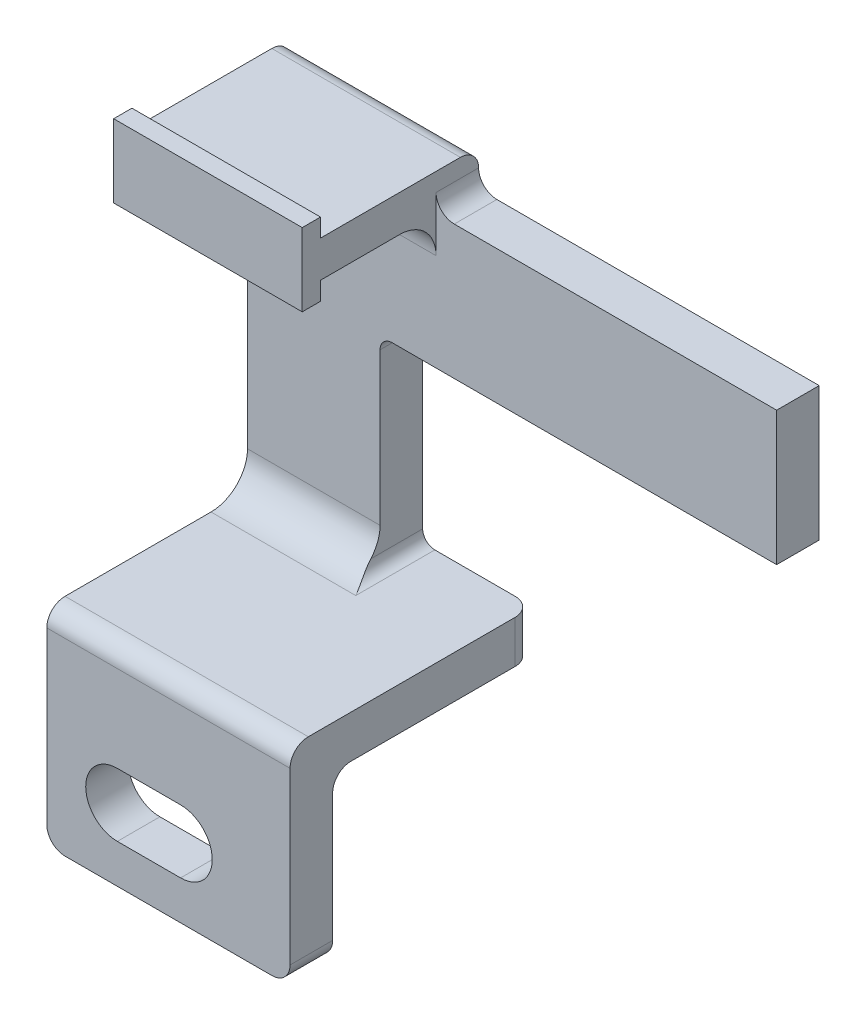
ISO-10303-21;
HEADER;
FILE_DESCRIPTION(('STEP AP214'),'2;1');
FILE_NAME('part.step','',(''),(''),'','','');
FILE_SCHEMA(('AUTOMOTIVE_DESIGN { 1 0 10303 214 1 1 1 1 }'));
ENDSEC;
DATA;
#1=APPLICATION_CONTEXT('core data for automotive mechanical design processes');
#2=APPLICATION_PROTOCOL_DEFINITION('international standard','automotive_design',2000,#1);
#3=PRODUCT_CONTEXT('',#1,'mechanical');
#4=PRODUCT('Part','Part','',(#3));
#5=PRODUCT_RELATED_PRODUCT_CATEGORY('part','',(#4));
#6=PRODUCT_DEFINITION_FORMATION('','',#4);
#7=PRODUCT_DEFINITION_CONTEXT('part definition',#1,'design');
#8=PRODUCT_DEFINITION('design','',#6,#7);
#9=PRODUCT_DEFINITION_SHAPE('','',#8);
#10=(LENGTH_UNIT() NAMED_UNIT(*) SI_UNIT(.MILLI.,.METRE.));
#11=(NAMED_UNIT(*) PLANE_ANGLE_UNIT() SI_UNIT($,.RADIAN.));
#12=(NAMED_UNIT(*) SI_UNIT($,.STERADIAN.) SOLID_ANGLE_UNIT());
#13=UNCERTAINTY_MEASURE_WITH_UNIT(LENGTH_MEASURE(1.E-05),#10,'distance_accuracy_value','');
#14=(GEOMETRIC_REPRESENTATION_CONTEXT(3) GLOBAL_UNCERTAINTY_ASSIGNED_CONTEXT((#13)) GLOBAL_UNIT_ASSIGNED_CONTEXT((#10,
#11,#12)) REPRESENTATION_CONTEXT('',''));
#15=CARTESIAN_POINT('',(0.,0.,0.));
#16=DIRECTION('',(0.,0.,1.));
#17=DIRECTION('',(1.,0.,0.));
#18=AXIS2_PLACEMENT_3D('',#15,#16,#17);
#19=CARTESIAN_POINT('',(9.1,-3.5,20.));
#20=DIRECTION('',(0.,0.,-1.));
#21=DIRECTION('',(-1.,0.,0.));
#22=AXIS2_PLACEMENT_3D('',#19,#20,#21);
#23=PLANE('',#22);
#24=DIRECTION('',(0.,1.,0.));
#25=VECTOR('',#24,1.);
#26=CARTESIAN_POINT('',(9.1,-3.5,20.));
#27=LINE('',#26,#25);
#28=CARTESIAN_POINT('',(9.1,-15.5,20.));
#29=VERTEX_POINT('',#28);
#30=CARTESIAN_POINT('',(9.1,-1.5,20.));
#31=VERTEX_POINT('',#30);
#32=EDGE_CURVE('E369',#29,#31,#27,.T.);
#33=ORIENTED_EDGE('',*,*,#32,.T.);
#34=DIRECTION('',(-1.,0.,0.));
#35=VECTOR('',#34,1.);
#36=CARTESIAN_POINT('',(9.1,-1.5,20.));
#37=LINE('',#36,#35);
#38=CARTESIAN_POINT('',(-10.9,-1.5,20.));
#39=VERTEX_POINT('',#38);
#40=EDGE_CURVE('E617',#31,#39,#37,.T.);
#41=ORIENTED_EDGE('',*,*,#40,.T.);
#42=DIRECTION('',(0.,1.,0.));
#43=VECTOR('',#42,1.);
#44=CARTESIAN_POINT('',(-10.9,-3.5,20.));
#45=LINE('',#44,#43);
#46=CARTESIAN_POINT('',(-10.9,-15.5,20.));
#47=VERTEX_POINT('',#46);
#48=EDGE_CURVE('E360',#47,#39,#45,.T.);
#49=ORIENTED_EDGE('',*,*,#48,.F.);
#50=CARTESIAN_POINT('',(-9.4,-15.5,20.));
#51=DIRECTION('',(0.,0.,-1.));
#52=DIRECTION('',(-1.,0.,0.));
#53=AXIS2_PLACEMENT_3D('',#50,#51,#52);
#54=CIRCLE('',#53,1.5);
#55=CARTESIAN_POINT('',(-9.39999999999999,-17.,20.));
#56=VERTEX_POINT('',#55);
#57=EDGE_CURVE('E615',#47,#56,#54,.F.);
#58=ORIENTED_EDGE('',*,*,#57,.T.);
#59=DIRECTION('',(-1.,0.,0.));
#60=VECTOR('',#59,1.);
#61=CARTESIAN_POINT('',(9.1,-17.,20.));
#62=LINE('',#61,#60);
#63=CARTESIAN_POINT('',(7.6,-17.,20.));
#64=VERTEX_POINT('',#63);
#65=EDGE_CURVE('E332',#64,#56,#62,.T.);
#66=ORIENTED_EDGE('',*,*,#65,.F.);
#67=CARTESIAN_POINT('',(7.6,-15.5,20.));
#68=DIRECTION('',(0.,0.,-1.));
#69=DIRECTION('',(-1.,0.,0.));
#70=AXIS2_PLACEMENT_3D('',#67,#68,#69);
#71=CIRCLE('',#70,1.5);
#72=EDGE_CURVE('E612',#64,#29,#71,.F.);
#73=ORIENTED_EDGE('',*,*,#72,.T.);
#74=EDGE_LOOP('',(#33,#41,#49,#58,#66,#73));
#75=FACE_BOUND('',#74,.T.);
#76=DIRECTION('',(1.,0.,0.));
#77=VECTOR('',#76,1.);
#78=CARTESIAN_POINT('',(0.,-8.6,20.));
#79=LINE('',#78,#77);
#80=CARTESIAN_POINT('',(-5.1,-8.6,20.));
#81=VERTEX_POINT('',#80);
#82=CARTESIAN_POINT('',(0.100000000000003,-8.6,20.));
#83=VERTEX_POINT('',#82);
#84=EDGE_CURVE('E266',#81,#83,#79,.T.);
#85=ORIENTED_EDGE('',*,*,#84,.T.);
#86=CARTESIAN_POINT('',(0.100000000000003,-11.2,20.));
#87=DIRECTION('',(0.,0.,-1.));
#88=DIRECTION('',(-1.,0.,0.));
#89=AXIS2_PLACEMENT_3D('',#86,#87,#88);
#90=CIRCLE('',#89,2.6);
#91=CARTESIAN_POINT('',(0.100000000000003,-13.8,20.));
#92=VERTEX_POINT('',#91);
#93=EDGE_CURVE('E289',#92,#83,#90,.F.);
#94=ORIENTED_EDGE('',*,*,#93,.F.);
#95=DIRECTION('',(1.,0.,0.));
#96=VECTOR('',#95,1.);
#97=CARTESIAN_POINT('',(0.,-13.8,20.));
#98=LINE('',#97,#96);
#99=CARTESIAN_POINT('',(-5.1,-13.8,20.));
#100=VERTEX_POINT('',#99);
#101=EDGE_CURVE('E730',#100,#92,#98,.T.);
#102=ORIENTED_EDGE('',*,*,#101,.F.);
#103=CARTESIAN_POINT('',(-5.1,-11.2,20.));
#104=DIRECTION('',(0.,0.,-1.));
#105=DIRECTION('',(-1.,0.,0.));
#106=AXIS2_PLACEMENT_3D('',#103,#104,#105);
#107=CIRCLE('',#106,2.6);
#108=EDGE_CURVE('E733',#81,#100,#107,.F.);
#109=ORIENTED_EDGE('',*,*,#108,.F.);
#110=EDGE_LOOP('',(#85,#94,#102,#109));
#111=FACE_BOUND('',#110,.T.);
#112=ADVANCED_FACE('F43',(#75,#111),#23,.F.);
#113=CARTESIAN_POINT('',(-10.9,-17.,16.5));
#114=DIRECTION('',(0.,0.,1.));
#115=DIRECTION('',(1.,0.,0.));
#116=AXIS2_PLACEMENT_3D('',#113,#114,#115);
#117=PLANE('',#116);
#118=DIRECTION('',(0.,1.,0.));
#119=VECTOR('',#118,1.);
#120=CARTESIAN_POINT('',(9.10000000000001,-17.,16.5));
#121=LINE('',#120,#119);
#122=CARTESIAN_POINT('',(9.10000000000001,-15.5,16.5));
#123=VERTEX_POINT('',#122);
#124=CARTESIAN_POINT('',(9.10000000000001,-5.,16.5));
#125=VERTEX_POINT('',#124);
#126=EDGE_CURVE('E344',#123,#125,#121,.T.);
#127=ORIENTED_EDGE('',*,*,#126,.F.);
#128=CARTESIAN_POINT('',(7.6,-15.5,16.5));
#129=DIRECTION('',(0.,0.,1.));
#130=DIRECTION('',(1.,0.,0.));
#131=AXIS2_PLACEMENT_3D('',#128,#129,#130);
#132=CIRCLE('',#131,1.5);
#133=CARTESIAN_POINT('',(7.6,-17.,16.5));
#134=VERTEX_POINT('',#133);
#135=EDGE_CURVE('E584',#123,#134,#132,.F.);
#136=ORIENTED_EDGE('',*,*,#135,.T.);
#137=DIRECTION('',(1.,0.,0.));
#138=VECTOR('',#137,1.);
#139=CARTESIAN_POINT('',(-10.9,-17.,16.5));
#140=LINE('',#139,#138);
#141=CARTESIAN_POINT('',(-9.4,-17.,16.5));
#142=VERTEX_POINT('',#141);
#143=EDGE_CURVE('E341',#142,#134,#140,.T.);
#144=ORIENTED_EDGE('',*,*,#143,.F.);
#145=CARTESIAN_POINT('',(-9.4,-15.5,16.5));
#146=DIRECTION('',(0.,0.,1.));
#147=DIRECTION('',(1.,0.,0.));
#148=AXIS2_PLACEMENT_3D('',#145,#146,#147);
#149=CIRCLE('',#148,1.5);
#150=CARTESIAN_POINT('',(-10.9,-15.5,16.5));
#151=VERTEX_POINT('',#150);
#152=EDGE_CURVE('E582',#142,#151,#149,.F.);
#153=ORIENTED_EDGE('',*,*,#152,.T.);
#154=DIRECTION('',(0.,1.,0.));
#155=VECTOR('',#154,1.);
#156=CARTESIAN_POINT('',(-10.9,-17.,16.5));
#157=LINE('',#156,#155);
#158=CARTESIAN_POINT('',(-10.9,-5.,16.5));
#159=VERTEX_POINT('',#158);
#160=EDGE_CURVE('E347',#151,#159,#157,.T.);
#161=ORIENTED_EDGE('',*,*,#160,.T.);
#162=DIRECTION('',(1.,0.,0.));
#163=VECTOR('',#162,1.);
#164=CARTESIAN_POINT('',(-10.9,-5.,16.5));
#165=LINE('',#164,#163);
#166=EDGE_CURVE('E579',#159,#125,#165,.T.);
#167=ORIENTED_EDGE('',*,*,#166,.T.);
#168=EDGE_LOOP('',(#127,#136,#144,#153,#161,#167));
#169=FACE_BOUND('',#168,.T.);
#170=DIRECTION('',(-1.,0.,0.));
#171=VECTOR('',#170,1.);
#172=CARTESIAN_POINT('',(0.,-8.6,16.5));
#173=LINE('',#172,#171);
#174=CARTESIAN_POINT('',(0.100000000000003,-8.6,16.5));
#175=VERTEX_POINT('',#174);
#176=CARTESIAN_POINT('',(-5.1,-8.6,16.5));
#177=VERTEX_POINT('',#176);
#178=EDGE_CURVE('E263',#175,#177,#173,.T.);
#179=ORIENTED_EDGE('',*,*,#178,.T.);
#180=CARTESIAN_POINT('',(-5.1,-11.2,16.5));
#181=DIRECTION('',(0.,0.,-1.));
#182=DIRECTION('',(-1.,0.,0.));
#183=AXIS2_PLACEMENT_3D('',#180,#181,#182);
#184=CIRCLE('',#183,2.6);
#185=CARTESIAN_POINT('',(-5.1,-13.8,16.5));
#186=VERTEX_POINT('',#185);
#187=EDGE_CURVE('E271',#186,#177,#184,.T.);
#188=ORIENTED_EDGE('',*,*,#187,.F.);
#189=DIRECTION('',(-1.,0.,0.));
#190=VECTOR('',#189,1.);
#191=CARTESIAN_POINT('',(0.,-13.8,16.5));
#192=LINE('',#191,#190);
#193=CARTESIAN_POINT('',(0.100000000000003,-13.8,16.5));
#194=VERTEX_POINT('',#193);
#195=EDGE_CURVE('E66',#194,#186,#192,.T.);
#196=ORIENTED_EDGE('',*,*,#195,.F.);
#197=CARTESIAN_POINT('',(0.100000000000003,-11.2,16.5));
#198=DIRECTION('',(0.,0.,-1.));
#199=DIRECTION('',(-1.,0.,0.));
#200=AXIS2_PLACEMENT_3D('',#197,#198,#199);
#201=CIRCLE('',#200,2.6);
#202=EDGE_CURVE('E278',#175,#194,#201,.T.);
#203=ORIENTED_EDGE('',*,*,#202,.F.);
#204=EDGE_LOOP('',(#179,#188,#196,#203));
#205=FACE_BOUND('',#204,.T.);
#206=ADVANCED_FACE('F276',(#169,#205),#117,.F.);
#207=CARTESIAN_POINT('',(32.6,27.5,3.5));
#208=DIRECTION('',(0.,-1.,0.));
#209=DIRECTION('',(1.,0.,0.));
#210=AXIS2_PLACEMENT_3D('',#207,#208,#209);
#211=PLANE('',#210);
#212=DIRECTION('',(-1.,0.,0.));
#213=VECTOR('',#212,1.);
#214=CARTESIAN_POINT('',(32.6,27.5,0.));
#215=LINE('',#214,#213);
#216=CARTESIAN_POINT('',(32.6,27.5,0.));
#217=VERTEX_POINT('',#216);
#218=CARTESIAN_POINT('',(6.1,27.5,0.));
#219=VERTEX_POINT('',#218);
#220=EDGE_CURVE('E396',#217,#219,#215,.T.);
#221=ORIENTED_EDGE('',*,*,#220,.T.);
#222=DIRECTION('',(0.,0.,-1.));
#223=VECTOR('',#222,1.);
#224=CARTESIAN_POINT('',(6.1,27.5,3.5));
#225=LINE('',#224,#223);
#226=CARTESIAN_POINT('',(6.1,27.5,3.5));
#227=VERTEX_POINT('',#226);
#228=EDGE_CURVE('E566',#219,#227,#225,.F.);
#229=ORIENTED_EDGE('',*,*,#228,.T.);
#230=DIRECTION('',(-1.,0.,0.));
#231=VECTOR('',#230,1.);
#232=CARTESIAN_POINT('',(32.6,27.5,3.5));
#233=LINE('',#232,#231);
#234=CARTESIAN_POINT('',(32.6,27.5,3.5));
#235=VERTEX_POINT('',#234);
#236=EDGE_CURVE('E382',#235,#227,#233,.T.);
#237=ORIENTED_EDGE('',*,*,#236,.F.);
#238=DIRECTION('',(0.,0.,-1.));
#239=VECTOR('',#238,1.);
#240=CARTESIAN_POINT('',(32.6,27.5,3.5));
#241=LINE('',#240,#239);
#242=EDGE_CURVE('E388',#235,#217,#241,.T.);
#243=ORIENTED_EDGE('',*,*,#242,.T.);
#244=EDGE_LOOP('',(#221,#229,#237,#243));
#245=FACE_BOUND('',#244,.T.);
#246=ADVANCED_FACE('F494',(#245),#211,.F.);
#247=CARTESIAN_POINT('',(0.,0.,3.5));
#248=DIRECTION('',(-1.,0.,0.));
#249=DIRECTION('',(0.,0.,1.));
#250=AXIS2_PLACEMENT_3D('',#247,#248,#249);
#251=PLANE('',#250);
#252=DIRECTION('',(0.,1.,0.));
#253=VECTOR('',#252,1.);
#254=CARTESIAN_POINT('',(0.,0.,3.5));
#255=LINE('',#254,#253);
#256=CARTESIAN_POINT('',(0.,3.,3.5));
#257=VERTEX_POINT('',#256);
#258=CARTESIAN_POINT('',(0.,15.5,3.5));
#259=VERTEX_POINT('',#258);
#260=EDGE_CURVE('E373',#257,#259,#255,.T.);
#261=ORIENTED_EDGE('',*,*,#260,.F.);
#262=CARTESIAN_POINT('',(0.,3.,6.5));
#263=DIRECTION('',(-1.,0.,0.));
#264=DIRECTION('',(0.,0.,1.));
#265=AXIS2_PLACEMENT_3D('',#262,#263,#264);
#266=CIRCLE('',#265,3.);
#267=CARTESIAN_POINT('',(0.,1.,4.26393202250021));
#268=VERTEX_POINT('',#267);
#269=EDGE_CURVE('E437',#257,#268,#266,.T.);
#270=ORIENTED_EDGE('',*,*,#269,.T.);
#271=DIRECTION('',(0.,0.,-1.));
#272=VECTOR('',#271,1.);
#273=CARTESIAN_POINT('',(0.,1.,0.));
#274=LINE('',#273,#272);
#275=CARTESIAN_POINT('',(0.,1.,0.));
#276=VERTEX_POINT('',#275);
#277=EDGE_CURVE('E412',#268,#276,#274,.T.);
#278=ORIENTED_EDGE('',*,*,#277,.T.);
#279=DIRECTION('',(0.,1.,0.));
#280=VECTOR('',#279,1.);
#281=CARTESIAN_POINT('',(0.,0.,0.));
#282=LINE('',#281,#280);
#283=CARTESIAN_POINT('',(0.,15.5,0.));
#284=VERTEX_POINT('',#283);
#285=EDGE_CURVE('E372',#276,#284,#282,.T.);
#286=ORIENTED_EDGE('',*,*,#285,.T.);
#287=DIRECTION('',(0.,0.,-1.));
#288=VECTOR('',#287,1.);
#289=CARTESIAN_POINT('',(0.,15.5,3.5));
#290=LINE('',#289,#288);
#291=EDGE_CURVE('E409',#259,#284,#290,.T.);
#292=ORIENTED_EDGE('',*,*,#291,.F.);
#293=EDGE_LOOP('',(#261,#270,#278,#286,#292));
#294=FACE_BOUND('',#293,.T.);
#295=ADVANCED_FACE('F522',(#294),#251,.F.);
#296=CARTESIAN_POINT('',(1.,15.5,3.5));
#297=DIRECTION('',(0.,0.,-1.));
#298=DIRECTION('',(-1.,0.,0.));
#299=AXIS2_PLACEMENT_3D('',#296,#297,#298);
#300=CYLINDRICAL_SURFACE('',#299,1.);
#301=CARTESIAN_POINT('',(1.,15.5,0.));
#302=DIRECTION('',(0.,0.,-1.));
#303=DIRECTION('',(-1.,0.,0.));
#304=AXIS2_PLACEMENT_3D('',#301,#302,#303);
#305=CIRCLE('',#304,1.);
#306=CARTESIAN_POINT('',(1.00000000000001,16.5,0.));
#307=VERTEX_POINT('',#306);
#308=EDGE_CURVE('E390',#284,#307,#305,.T.);
#309=ORIENTED_EDGE('',*,*,#308,.T.);
#310=DIRECTION('',(0.,0.,-1.));
#311=VECTOR('',#310,1.);
#312=CARTESIAN_POINT('',(1.00000000000001,16.5,3.5));
#313=LINE('',#312,#311);
#314=CARTESIAN_POINT('',(1.00000000000001,16.5,3.5));
#315=VERTEX_POINT('',#314);
#316=EDGE_CURVE('E406',#315,#307,#313,.T.);
#317=ORIENTED_EDGE('',*,*,#316,.F.);
#318=CARTESIAN_POINT('',(1.,15.5,3.5));
#319=DIRECTION('',(0.,0.,-1.));
#320=DIRECTION('',(-1.,0.,0.));
#321=AXIS2_PLACEMENT_3D('',#318,#319,#320);
#322=CIRCLE('',#321,1.);
#323=EDGE_CURVE('E375',#259,#315,#322,.T.);
#324=ORIENTED_EDGE('',*,*,#323,.F.);
#325=ORIENTED_EDGE('',*,*,#291,.T.);
#326=EDGE_LOOP('',(#309,#317,#324,#325));
#327=FACE_BOUND('',#326,.T.);
#328=ADVANCED_FACE('F530',(#327),#300,.F.);
#329=CARTESIAN_POINT('',(1.00000000000001,16.5,3.5));
#330=DIRECTION('',(0.,1.,0.));
#331=DIRECTION('',(0.,0.,1.));
#332=AXIS2_PLACEMENT_3D('',#329,#330,#331);
#333=PLANE('',#332);
#334=DIRECTION('',(1.,0.,0.));
#335=VECTOR('',#334,1.);
#336=CARTESIAN_POINT('',(1.00000000000001,16.5,0.));
#337=LINE('',#336,#335);
#338=CARTESIAN_POINT('',(32.6,16.5,0.));
#339=VERTEX_POINT('',#338);
#340=EDGE_CURVE('E392',#307,#339,#337,.T.);
#341=ORIENTED_EDGE('',*,*,#340,.T.);
#342=DIRECTION('',(0.,0.,-1.));
#343=VECTOR('',#342,1.);
#344=CARTESIAN_POINT('',(32.6,16.5,3.5));
#345=LINE('',#344,#343);
#346=CARTESIAN_POINT('',(32.6,16.5,3.5));
#347=VERTEX_POINT('',#346);
#348=EDGE_CURVE('E403',#347,#339,#345,.T.);
#349=ORIENTED_EDGE('',*,*,#348,.F.);
#350=DIRECTION('',(1.,0.,0.));
#351=VECTOR('',#350,1.);
#352=CARTESIAN_POINT('',(1.00000000000001,16.5,3.5));
#353=LINE('',#352,#351);
#354=EDGE_CURVE('E378',#315,#347,#353,.T.);
#355=ORIENTED_EDGE('',*,*,#354,.F.);
#356=ORIENTED_EDGE('',*,*,#316,.T.);
#357=EDGE_LOOP('',(#341,#349,#355,#356));
#358=FACE_BOUND('',#357,.T.);
#359=ADVANCED_FACE('F526',(#358),#333,.F.);
#360=CARTESIAN_POINT('',(32.6,16.5,3.5));
#361=DIRECTION('',(-1.,0.,0.));
#362=DIRECTION('',(0.,-1.,0.));
#363=AXIS2_PLACEMENT_3D('',#360,#361,#362);
#364=PLANE('',#363);
#365=DIRECTION('',(0.,1.,0.));
#366=VECTOR('',#365,1.);
#367=CARTESIAN_POINT('',(32.6,16.5,0.));
#368=LINE('',#367,#366);
#369=EDGE_CURVE('E394',#339,#217,#368,.T.);
#370=ORIENTED_EDGE('',*,*,#369,.T.);
#371=ORIENTED_EDGE('',*,*,#242,.F.);
#372=DIRECTION('',(0.,1.,0.));
#373=VECTOR('',#372,1.);
#374=CARTESIAN_POINT('',(32.6,16.5,3.5));
#375=LINE('',#374,#373);
#376=EDGE_CURVE('E380',#347,#235,#375,.T.);
#377=ORIENTED_EDGE('',*,*,#376,.F.);
#378=ORIENTED_EDGE('',*,*,#348,.T.);
#379=EDGE_LOOP('',(#370,#371,#377,#378));
#380=FACE_BOUND('',#379,.T.);
#381=ADVANCED_FACE('F518',(#380),#364,.F.);
#382=CARTESIAN_POINT('',(-10.9,27.5,3.5));
#383=DIRECTION('',(1.,0.,0.));
#384=DIRECTION('',(0.,1.,0.));
#385=AXIS2_PLACEMENT_3D('',#382,#383,#384);
#386=PLANE('',#385);
#387=ORIENTED_EDGE('',*,*,#48,.T.);
#388=CARTESIAN_POINT('',(-10.9,-1.5,18.5));
#389=DIRECTION('',(1.,0.,0.));
#390=DIRECTION('',(0.,1.,0.));
#391=AXIS2_PLACEMENT_3D('',#388,#389,#390);
#392=CIRCLE('',#391,1.5);
#393=CARTESIAN_POINT('',(-10.9,0.,18.5));
#394=VERTEX_POINT('',#393);
#395=EDGE_CURVE('E624',#39,#394,#392,.F.);
#396=ORIENTED_EDGE('',*,*,#395,.T.);
#397=DIRECTION('',(0.,0.,-1.));
#398=VECTOR('',#397,1.);
#399=CARTESIAN_POINT('',(-10.9,0.,20.));
#400=LINE('',#399,#398);
#401=CARTESIAN_POINT('',(-10.9,0.,6.5));
#402=VERTEX_POINT('',#401);
#403=EDGE_CURVE('E350',#394,#402,#400,.T.);
#404=ORIENTED_EDGE('',*,*,#403,.T.);
#405=CARTESIAN_POINT('',(-10.9,3.,6.5));
#406=DIRECTION('',(1.,0.,0.));
#407=DIRECTION('',(0.,1.,0.));
#408=AXIS2_PLACEMENT_3D('',#405,#406,#407);
#409=CIRCLE('',#408,3.);
#410=CARTESIAN_POINT('',(-10.9,3.,3.5));
#411=VERTEX_POINT('',#410);
#412=EDGE_CURVE('E449',#402,#411,#409,.T.);
#413=ORIENTED_EDGE('',*,*,#412,.T.);
#414=DIRECTION('',(0.,-1.,0.));
#415=VECTOR('',#414,1.);
#416=CARTESIAN_POINT('',(-10.9,27.5,3.5));
#417=LINE('',#416,#415);
#418=CARTESIAN_POINT('',(-10.9,24.5,3.5));
#419=VERTEX_POINT('',#418);
#420=EDGE_CURVE('E385',#419,#411,#417,.T.);
#421=ORIENTED_EDGE('',*,*,#420,.F.);
#422=CARTESIAN_POINT('',(-10.9,24.5,6.5));
#423=DIRECTION('',(1.,0.,0.));
#424=DIRECTION('',(0.,1.,0.));
#425=AXIS2_PLACEMENT_3D('',#422,#423,#424);
#426=CIRCLE('',#425,3.);
#427=CARTESIAN_POINT('',(-10.9,27.5,6.5));
#428=VERTEX_POINT('',#427);
#429=EDGE_CURVE('E433',#419,#428,#426,.T.);
#430=ORIENTED_EDGE('',*,*,#429,.T.);
#431=DIRECTION('',(0.,0.,1.));
#432=VECTOR('',#431,1.);
#433=CARTESIAN_POINT('',(-10.9,27.5,13.));
#434=LINE('',#433,#432);
#435=CARTESIAN_POINT('',(-10.9,27.5,13.));
#436=VERTEX_POINT('',#435);
#437=EDGE_CURVE('E323',#428,#436,#434,.T.);
#438=ORIENTED_EDGE('',*,*,#437,.T.);
#439=DIRECTION('',(0.,-1.,0.));
#440=VECTOR('',#439,1.);
#441=CARTESIAN_POINT('',(-10.9,32.,13.));
#442=LINE('',#441,#440);
#443=CARTESIAN_POINT('',(-10.9,26.,13.));
#444=VERTEX_POINT('',#443);
#445=EDGE_CURVE('E305',#436,#444,#442,.T.);
#446=ORIENTED_EDGE('',*,*,#445,.T.);
#447=DIRECTION('',(0.,0.,-1.));
#448=VECTOR('',#447,1.);
#449=CARTESIAN_POINT('',(-10.9,26.,14.5));
#450=LINE('',#449,#448);
#451=CARTESIAN_POINT('',(-10.9,26.,14.5));
#452=VERTEX_POINT('',#451);
#453=EDGE_CURVE('E320',#452,#444,#450,.T.);
#454=ORIENTED_EDGE('',*,*,#453,.F.);
#455=DIRECTION('',(0.,-1.,0.));
#456=VECTOR('',#455,1.);
#457=CARTESIAN_POINT('',(-10.9,32.,14.5));
#458=LINE('',#457,#456);
#459=CARTESIAN_POINT('',(-10.9,32.,14.5));
#460=VERTEX_POINT('',#459);
#461=EDGE_CURVE('E290',#460,#452,#458,.T.);
#462=ORIENTED_EDGE('',*,*,#461,.F.);
#463=DIRECTION('',(0.,0.,-1.));
#464=VECTOR('',#463,1.);
#465=CARTESIAN_POINT('',(-10.9,32.,14.5));
#466=LINE('',#465,#464);
#467=CARTESIAN_POINT('',(-10.9,32.,13.));
#468=VERTEX_POINT('',#467);
#469=EDGE_CURVE('E300',#460,#468,#466,.T.);
#470=ORIENTED_EDGE('',*,*,#469,.T.);
#471=CARTESIAN_POINT('',(-10.9,30.5,13.));
#472=VERTEX_POINT('',#471);
#473=EDGE_CURVE('E301',#468,#472,#442,.T.);
#474=ORIENTED_EDGE('',*,*,#473,.T.);
#475=DIRECTION('',(0.,0.,1.));
#476=VECTOR('',#475,1.);
#477=CARTESIAN_POINT('',(-10.9,30.5,0.));
#478=LINE('',#477,#476);
#479=CARTESIAN_POINT('',(-10.9,30.5,1.5));
#480=VERTEX_POINT('',#479);
#481=EDGE_CURVE('E324',#480,#472,#478,.T.);
#482=ORIENTED_EDGE('',*,*,#481,.F.);
#483=CARTESIAN_POINT('',(-10.9,29.,1.5));
#484=DIRECTION('',(1.,0.,0.));
#485=DIRECTION('',(0.,1.,0.));
#486=AXIS2_PLACEMENT_3D('',#483,#484,#485);
#487=CIRCLE('',#486,1.5);
#488=CARTESIAN_POINT('',(-10.9,29.,0.));
#489=VERTEX_POINT('',#488);
#490=EDGE_CURVE('E622',#480,#489,#487,.F.);
#491=ORIENTED_EDGE('',*,*,#490,.T.);
#492=DIRECTION('',(0.,-1.,0.));
#493=VECTOR('',#492,1.);
#494=CARTESIAN_POINT('',(-10.9,27.5,0.));
#495=LINE('',#494,#493);
#496=CARTESIAN_POINT('',(-10.9,-3.5,0.));
#497=VERTEX_POINT('',#496);
#498=EDGE_CURVE('E376',#489,#497,#495,.T.);
#499=ORIENTED_EDGE('',*,*,#498,.T.);
#500=DIRECTION('',(0.,0.,-1.));
#501=VECTOR('',#500,1.);
#502=CARTESIAN_POINT('',(-10.9,-3.5,20.));
#503=LINE('',#502,#501);
#504=CARTESIAN_POINT('',(-10.9,-3.5,15.));
#505=VERTEX_POINT('',#504);
#506=EDGE_CURVE('E351',#505,#497,#503,.T.);
#507=ORIENTED_EDGE('',*,*,#506,.F.);
#508=CARTESIAN_POINT('',(-10.9,-5.,15.));
#509=DIRECTION('',(1.,0.,0.));
#510=DIRECTION('',(0.,1.,0.));
#511=AXIS2_PLACEMENT_3D('',#508,#509,#510);
#512=CIRCLE('',#511,1.5);
#513=EDGE_CURVE('E11',#505,#159,#512,.T.);
#514=ORIENTED_EDGE('',*,*,#513,.T.);
#515=ORIENTED_EDGE('',*,*,#160,.F.);
#516=DIRECTION('',(0.,0.,-1.));
#517=VECTOR('',#516,1.);
#518=CARTESIAN_POINT('',(-10.9,-15.5,20.));
#519=LINE('',#518,#517);
#520=EDGE_CURVE('E607',#151,#47,#519,.F.);
#521=ORIENTED_EDGE('',*,*,#520,.T.);
#522=EDGE_LOOP('',(#387,#396,#404,#413,#421,#430,#438,#446,#454,#462,#470,#474,#482,#491,#499,
#507,#514,#515,#521));
#523=FACE_BOUND('',#522,.T.);
#524=ADVANCED_FACE('F511',(#523),#386,.F.);
#525=CARTESIAN_POINT('',(1.,15.5,3.5));
#526=DIRECTION('',(0.,0.,-1.));
#527=DIRECTION('',(-1.,0.,0.));
#528=AXIS2_PLACEMENT_3D('',#525,#526,#527);
#529=PLANE('',#528);
#530=DIRECTION('',(0.,-1.,0.));
#531=VECTOR('',#530,1.);
#532=CARTESIAN_POINT('',(4.6,30.5,3.5));
#533=LINE('',#532,#531);
#534=CARTESIAN_POINT('',(4.6,29.,3.5));
#535=VERTEX_POINT('',#534);
#536=CARTESIAN_POINT('',(4.6,24.5,3.5));
#537=VERTEX_POINT('',#536);
#538=EDGE_CURVE('E422',#535,#537,#533,.T.);
#539=ORIENTED_EDGE('',*,*,#538,.T.);
#540=DIRECTION('',(-1.,0.,0.));
#541=VECTOR('',#540,1.);
#542=CARTESIAN_POINT('',(-10.9,24.5,3.5));
#543=LINE('',#542,#541);
#544=EDGE_CURVE('E425',#537,#419,#543,.T.);
#545=ORIENTED_EDGE('',*,*,#544,.T.);
#546=ORIENTED_EDGE('',*,*,#420,.T.);
#547=DIRECTION('',(1.,0.,0.));
#548=VECTOR('',#547,1.);
#549=CARTESIAN_POINT('',(1.,3.,3.5));
#550=LINE('',#549,#548);
#551=EDGE_CURVE('E419',#411,#257,#550,.T.);
#552=ORIENTED_EDGE('',*,*,#551,.T.);
#553=ORIENTED_EDGE('',*,*,#260,.T.);
#554=ORIENTED_EDGE('',*,*,#323,.T.);
#555=ORIENTED_EDGE('',*,*,#354,.T.);
#556=ORIENTED_EDGE('',*,*,#376,.T.);
#557=ORIENTED_EDGE('',*,*,#236,.T.);
#558=CARTESIAN_POINT('',(6.1,29.,3.5));
#559=DIRECTION('',(0.,0.,-1.));
#560=DIRECTION('',(-1.,0.,0.));
#561=AXIS2_PLACEMENT_3D('',#558,#559,#560);
#562=CIRCLE('',#561,1.5);
#563=EDGE_CURVE('E592',#227,#535,#562,.T.);
#564=ORIENTED_EDGE('',*,*,#563,.T.);
#565=EDGE_LOOP('',(#539,#545,#546,#552,#553,#554,#555,#556,#557,#564));
#566=FACE_BOUND('',#565,.T.);
#567=ADVANCED_FACE('F508',(#566),#529,.F.);
#568=CARTESIAN_POINT('',(1.,15.5,0.));
#569=DIRECTION('',(0.,0.,-1.));
#570=DIRECTION('',(-1.,0.,0.));
#571=AXIS2_PLACEMENT_3D('',#568,#569,#570);
#572=PLANE('',#571);
#573=ORIENTED_EDGE('',*,*,#498,.F.);
#574=DIRECTION('',(-1.,0.,0.));
#575=VECTOR('',#574,1.);
#576=CARTESIAN_POINT('',(1.,29.,0.));
#577=LINE('',#576,#575);
#578=CARTESIAN_POINT('',(4.6,29.,0.));
#579=VERTEX_POINT('',#578);
#580=EDGE_CURVE('E641',#489,#579,#577,.F.);
#581=ORIENTED_EDGE('',*,*,#580,.T.);
#582=CARTESIAN_POINT('',(6.1,29.,0.));
#583=DIRECTION('',(0.,0.,-1.));
#584=DIRECTION('',(-1.,0.,0.));
#585=AXIS2_PLACEMENT_3D('',#582,#583,#584);
#586=CIRCLE('',#585,1.5);
#587=EDGE_CURVE('E590',#579,#219,#586,.F.);
#588=ORIENTED_EDGE('',*,*,#587,.T.);
#589=ORIENTED_EDGE('',*,*,#220,.F.);
#590=ORIENTED_EDGE('',*,*,#369,.F.);
#591=ORIENTED_EDGE('',*,*,#340,.F.);
#592=ORIENTED_EDGE('',*,*,#308,.F.);
#593=ORIENTED_EDGE('',*,*,#285,.F.);
#594=CARTESIAN_POINT('',(1.,1.,0.));
#595=DIRECTION('',(0.,0.,-1.));
#596=DIRECTION('',(-1.,0.,0.));
#597=AXIS2_PLACEMENT_3D('',#594,#595,#596);
#598=CIRCLE('',#597,1.);
#599=CARTESIAN_POINT('',(1.,0.,0.));
#600=VERTEX_POINT('',#599);
#601=EDGE_CURVE('E417',#276,#600,#598,.F.);
#602=ORIENTED_EDGE('',*,*,#601,.T.);
#603=DIRECTION('',(1.,0.,0.));
#604=VECTOR('',#603,1.);
#605=CARTESIAN_POINT('',(-10.9,0.,0.));
#606=LINE('',#605,#604);
#607=CARTESIAN_POINT('',(7.60000000000001,0.,0.));
#608=VERTEX_POINT('',#607);
#609=EDGE_CURVE('E362',#600,#608,#606,.T.);
#610=ORIENTED_EDGE('',*,*,#609,.T.);
#611=DIRECTION('',(0.,1.,0.));
#612=VECTOR('',#611,1.);
#613=CARTESIAN_POINT('',(7.60000000000001,-3.5,0.));
#614=LINE('',#613,#612);
#615=CARTESIAN_POINT('',(7.60000000000001,-3.5,0.));
#616=VERTEX_POINT('',#615);
#617=EDGE_CURVE('E639',#608,#616,#614,.F.);
#618=ORIENTED_EDGE('',*,*,#617,.T.);
#619=DIRECTION('',(1.,0.,0.));
#620=VECTOR('',#619,1.);
#621=CARTESIAN_POINT('',(-10.9,-3.5,0.));
#622=LINE('',#621,#620);
#623=EDGE_CURVE('E353',#497,#616,#622,.T.);
#624=ORIENTED_EDGE('',*,*,#623,.F.);
#625=EDGE_LOOP('',(#573,#581,#588,#589,#590,#591,#592,#593,#602,#610,#618,#624));
#626=FACE_BOUND('',#625,.T.);
#627=ADVANCED_FACE('F506',(#626),#572,.T.);
#628=CARTESIAN_POINT('',(9.1,-3.5,20.));
#629=DIRECTION('',(-1.,0.,0.));
#630=DIRECTION('',(0.,0.,1.));
#631=AXIS2_PLACEMENT_3D('',#628,#629,#630);
#632=PLANE('',#631);
#633=DIRECTION('',(0.,0.,1.));
#634=VECTOR('',#633,1.);
#635=CARTESIAN_POINT('',(9.1,0.,20.));
#636=LINE('',#635,#634);
#637=CARTESIAN_POINT('',(9.10000000000001,0.,1.5));
#638=VERTEX_POINT('',#637);
#639=CARTESIAN_POINT('',(9.1,0.,18.5));
#640=VERTEX_POINT('',#639);
#641=EDGE_CURVE('E354',#638,#640,#636,.T.);
#642=ORIENTED_EDGE('',*,*,#641,.T.);
#643=CARTESIAN_POINT('',(9.1,-1.5,18.5));
#644=DIRECTION('',(-1.,0.,0.));
#645=DIRECTION('',(0.,0.,1.));
#646=AXIS2_PLACEMENT_3D('',#643,#644,#645);
#647=CIRCLE('',#646,1.5);
#648=EDGE_CURVE('E634',#640,#31,#647,.F.);
#649=ORIENTED_EDGE('',*,*,#648,.T.);
#650=ORIENTED_EDGE('',*,*,#32,.F.);
#651=DIRECTION('',(0.,0.,1.));
#652=VECTOR('',#651,1.);
#653=CARTESIAN_POINT('',(9.1,-15.5,16.5));
#654=LINE('',#653,#652);
#655=EDGE_CURVE('E632',#29,#123,#654,.F.);
#656=ORIENTED_EDGE('',*,*,#655,.T.);
#657=ORIENTED_EDGE('',*,*,#126,.T.);
#658=CARTESIAN_POINT('',(9.1,-5.,15.));
#659=DIRECTION('',(-1.,0.,0.));
#660=DIRECTION('',(0.,0.,1.));
#661=AXIS2_PLACEMENT_3D('',#658,#659,#660);
#662=CIRCLE('',#661,1.5);
#663=CARTESIAN_POINT('',(9.1,-3.5,15.));
#664=VERTEX_POINT('',#663);
#665=EDGE_CURVE('E51',#125,#664,#662,.T.);
#666=ORIENTED_EDGE('',*,*,#665,.T.);
#667=DIRECTION('',(0.,0.,1.));
#668=VECTOR('',#667,1.);
#669=CARTESIAN_POINT('',(9.1,-3.5,20.));
#670=LINE('',#669,#668);
#671=CARTESIAN_POINT('',(9.10000000000001,-3.5,1.5));
#672=VERTEX_POINT('',#671);
#673=EDGE_CURVE('E357',#672,#664,#670,.T.);
#674=ORIENTED_EDGE('',*,*,#673,.F.);
#675=DIRECTION('',(0.,1.,0.));
#676=VECTOR('',#675,1.);
#677=CARTESIAN_POINT('',(9.10000000000001,0.,1.5));
#678=LINE('',#677,#676);
#679=EDGE_CURVE('E630',#672,#638,#678,.T.);
#680=ORIENTED_EDGE('',*,*,#679,.T.);
#681=EDGE_LOOP('',(#642,#649,#650,#656,#657,#666,#674,#680));
#682=FACE_BOUND('',#681,.T.);
#683=ADVANCED_FACE('F502',(#682),#632,.F.);
#684=CARTESIAN_POINT('',(0.,-3.5,0.));
#685=DIRECTION('',(0.,-1.,0.));
#686=DIRECTION('',(0.,0.,-1.));
#687=AXIS2_PLACEMENT_3D('',#684,#685,#686);
#688=PLANE('',#687);
#689=ORIENTED_EDGE('',*,*,#623,.T.);
#690=CARTESIAN_POINT('',(7.60000000000001,-3.5,1.5));
#691=DIRECTION('',(0.,-1.,0.));
#692=DIRECTION('',(0.,0.,-1.));
#693=AXIS2_PLACEMENT_3D('',#690,#691,#692);
#694=CIRCLE('',#693,1.5);
#695=EDGE_CURVE('E588',#616,#672,#694,.T.);
#696=ORIENTED_EDGE('',*,*,#695,.T.);
#697=ORIENTED_EDGE('',*,*,#673,.T.);
#698=DIRECTION('',(1.,0.,0.));
#699=VECTOR('',#698,1.);
#700=CARTESIAN_POINT('',(0.,-3.5,15.));
#701=LINE('',#700,#699);
#702=EDGE_CURVE('E586',#664,#505,#701,.F.);
#703=ORIENTED_EDGE('',*,*,#702,.T.);
#704=ORIENTED_EDGE('',*,*,#506,.T.);
#705=EDGE_LOOP('',(#689,#696,#697,#703,#704));
#706=FACE_BOUND('',#705,.T.);
#707=ADVANCED_FACE('F505',(#706),#688,.T.);
#708=CARTESIAN_POINT('',(0.,0.,0.));
#709=DIRECTION('',(0.,-1.,0.));
#710=DIRECTION('',(0.,0.,-1.));
#711=AXIS2_PLACEMENT_3D('',#708,#709,#710);
#712=PLANE('',#711);
#713=ORIENTED_EDGE('',*,*,#403,.F.);
#714=DIRECTION('',(-1.,0.,0.));
#715=VECTOR('',#714,1.);
#716=CARTESIAN_POINT('',(0.,0.,18.5));
#717=LINE('',#716,#715);
#718=EDGE_CURVE('E628',#394,#640,#717,.F.);
#719=ORIENTED_EDGE('',*,*,#718,.T.);
#720=ORIENTED_EDGE('',*,*,#641,.F.);
#721=CARTESIAN_POINT('',(7.60000000000001,0.,1.5));
#722=DIRECTION('',(0.,-1.,0.));
#723=DIRECTION('',(0.,0.,-1.));
#724=AXIS2_PLACEMENT_3D('',#721,#722,#723);
#725=CIRCLE('',#724,1.5);
#726=EDGE_CURVE('E626',#638,#608,#725,.F.);
#727=ORIENTED_EDGE('',*,*,#726,.T.);
#728=ORIENTED_EDGE('',*,*,#609,.F.);
#729=DIRECTION('',(0.,0.,-1.));
#730=VECTOR('',#729,1.);
#731=CARTESIAN_POINT('',(1.,0.,3.5));
#732=LINE('',#731,#730);
#733=CARTESIAN_POINT('',(1.,0.,6.5));
#734=VERTEX_POINT('',#733);
#735=EDGE_CURVE('E415',#600,#734,#732,.F.);
#736=ORIENTED_EDGE('',*,*,#735,.T.);
#737=DIRECTION('',(1.,0.,0.));
#738=VECTOR('',#737,1.);
#739=CARTESIAN_POINT('',(-10.9,0.,6.5));
#740=LINE('',#739,#738);
#741=EDGE_CURVE('E430',#734,#402,#740,.F.);
#742=ORIENTED_EDGE('',*,*,#741,.T.);
#743=EDGE_LOOP('',(#713,#719,#720,#727,#728,#736,#742));
#744=FACE_BOUND('',#743,.T.);
#745=ADVANCED_FACE('F500',(#744),#712,.F.);
#746=CARTESIAN_POINT('',(0.,-17.,0.));
#747=DIRECTION('',(0.,-1.,0.));
#748=DIRECTION('',(0.,0.,-1.));
#749=AXIS2_PLACEMENT_3D('',#746,#747,#748);
#750=PLANE('',#749);
#751=ORIENTED_EDGE('',*,*,#143,.T.);
#752=DIRECTION('',(0.,0.,1.));
#753=VECTOR('',#752,1.);
#754=CARTESIAN_POINT('',(7.6,-17.,20.));
#755=LINE('',#754,#753);
#756=EDGE_CURVE('E571',#134,#64,#755,.T.);
#757=ORIENTED_EDGE('',*,*,#756,.T.);
#758=ORIENTED_EDGE('',*,*,#65,.T.);
#759=DIRECTION('',(0.,0.,-1.));
#760=VECTOR('',#759,1.);
#761=CARTESIAN_POINT('',(-9.4,-17.,16.5));
#762=LINE('',#761,#760);
#763=EDGE_CURVE('E567',#56,#142,#762,.T.);
#764=ORIENTED_EDGE('',*,*,#763,.T.);
#765=EDGE_LOOP('',(#751,#757,#758,#764));
#766=FACE_BOUND('',#765,.T.);
#767=ADVANCED_FACE('F609',(#766),#750,.T.);
#768=CARTESIAN_POINT('',(4.6,30.5,3.5));
#769=DIRECTION('',(-1.,0.,0.));
#770=DIRECTION('',(0.,0.,1.));
#771=AXIS2_PLACEMENT_3D('',#768,#769,#770);
#772=PLANE('',#771);
#773=DIRECTION('',(0.,0.,-1.));
#774=VECTOR('',#773,1.);
#775=CARTESIAN_POINT('',(4.6,29.,0.));
#776=LINE('',#775,#774);
#777=EDGE_CURVE('E573',#535,#579,#776,.T.);
#778=ORIENTED_EDGE('',*,*,#777,.T.);
#779=CARTESIAN_POINT('',(4.6,29.,1.5));
#780=DIRECTION('',(-1.,0.,0.));
#781=DIRECTION('',(0.,0.,1.));
#782=AXIS2_PLACEMENT_3D('',#779,#780,#781);
#783=CIRCLE('',#782,1.5);
#784=CARTESIAN_POINT('',(4.6,30.5,1.5));
#785=VERTEX_POINT('',#784);
#786=EDGE_CURVE('E568',#579,#785,#783,.F.);
#787=ORIENTED_EDGE('',*,*,#786,.T.);
#788=DIRECTION('',(0.,0.,-1.));
#789=VECTOR('',#788,1.);
#790=CARTESIAN_POINT('',(4.6,30.5,3.5));
#791=LINE('',#790,#789);
#792=CARTESIAN_POINT('',(4.6,30.5,13.));
#793=VERTEX_POINT('',#792);
#794=EDGE_CURVE('E329',#793,#785,#791,.T.);
#795=ORIENTED_EDGE('',*,*,#794,.F.);
#796=DIRECTION('',(0.,1.,0.));
#797=VECTOR('',#796,1.);
#798=CARTESIAN_POINT('',(4.6,32.,13.));
#799=LINE('',#798,#797);
#800=CARTESIAN_POINT('',(4.6,32.,13.));
#801=VERTEX_POINT('',#800);
#802=EDGE_CURVE('E307',#793,#801,#799,.T.);
#803=ORIENTED_EDGE('',*,*,#802,.T.);
#804=DIRECTION('',(0.,0.,-1.));
#805=VECTOR('',#804,1.);
#806=CARTESIAN_POINT('',(4.6,32.,14.5));
#807=LINE('',#806,#805);
#808=CARTESIAN_POINT('',(4.6,32.,14.5));
#809=VERTEX_POINT('',#808);
#810=EDGE_CURVE('E314',#809,#801,#807,.T.);
#811=ORIENTED_EDGE('',*,*,#810,.F.);
#812=DIRECTION('',(0.,1.,0.));
#813=VECTOR('',#812,1.);
#814=CARTESIAN_POINT('',(4.6,32.,14.5));
#815=LINE('',#814,#813);
#816=CARTESIAN_POINT('',(4.6,26.,14.5));
#817=VERTEX_POINT('',#816);
#818=EDGE_CURVE('E296',#817,#809,#815,.T.);
#819=ORIENTED_EDGE('',*,*,#818,.F.);
#820=DIRECTION('',(0.,0.,-1.));
#821=VECTOR('',#820,1.);
#822=CARTESIAN_POINT('',(4.6,26.,14.5));
#823=LINE('',#822,#821);
#824=CARTESIAN_POINT('',(4.6,26.,13.));
#825=VERTEX_POINT('',#824);
#826=EDGE_CURVE('E317',#817,#825,#823,.T.);
#827=ORIENTED_EDGE('',*,*,#826,.T.);
#828=CARTESIAN_POINT('',(4.6,27.5,13.));
#829=VERTEX_POINT('',#828);
#830=EDGE_CURVE('E308',#825,#829,#799,.T.);
#831=ORIENTED_EDGE('',*,*,#830,.T.);
#832=DIRECTION('',(0.,0.,-1.));
#833=VECTOR('',#832,1.);
#834=CARTESIAN_POINT('',(4.6,27.5,3.5));
#835=LINE('',#834,#833);
#836=CARTESIAN_POINT('',(4.6,27.5,6.5));
#837=VERTEX_POINT('',#836);
#838=EDGE_CURVE('E327',#829,#837,#835,.T.);
#839=ORIENTED_EDGE('',*,*,#838,.T.);
#840=CARTESIAN_POINT('',(4.6,24.5,6.5));
#841=DIRECTION('',(-1.,0.,0.));
#842=DIRECTION('',(0.,0.,1.));
#843=AXIS2_PLACEMENT_3D('',#840,#841,#842);
#844=CIRCLE('',#843,3.);
#845=EDGE_CURVE('E435',#837,#537,#844,.T.);
#846=ORIENTED_EDGE('',*,*,#845,.T.);
#847=ORIENTED_EDGE('',*,*,#538,.F.);
#848=EDGE_LOOP('',(#778,#787,#795,#803,#811,#819,#827,#831,#839,#846,#847));
#849=FACE_BOUND('',#848,.T.);
#850=ADVANCED_FACE('F646',(#849),#772,.F.);
#851=CARTESIAN_POINT('',(0.,30.5,0.));
#852=DIRECTION('',(0.,1.,0.));
#853=DIRECTION('',(0.,0.,1.));
#854=AXIS2_PLACEMENT_3D('',#851,#852,#853);
#855=PLANE('',#854);
#856=ORIENTED_EDGE('',*,*,#794,.T.);
#857=DIRECTION('',(-1.,0.,0.));
#858=VECTOR('',#857,1.);
#859=CARTESIAN_POINT('',(0.,30.5,1.5));
#860=LINE('',#859,#858);
#861=EDGE_CURVE('E636',#785,#480,#860,.T.);
#862=ORIENTED_EDGE('',*,*,#861,.T.);
#863=ORIENTED_EDGE('',*,*,#481,.T.);
#864=DIRECTION('',(1.,0.,0.));
#865=VECTOR('',#864,1.);
#866=CARTESIAN_POINT('',(4.6,30.5,13.));
#867=LINE('',#866,#865);
#868=EDGE_CURVE('E326',#472,#793,#867,.T.);
#869=ORIENTED_EDGE('',*,*,#868,.T.);
#870=EDGE_LOOP('',(#856,#862,#863,#869));
#871=FACE_BOUND('',#870,.T.);
#872=ADVANCED_FACE('F654',(#871),#855,.T.);
#873=CARTESIAN_POINT('',(0.,27.5,0.));
#874=DIRECTION('',(0.,1.,0.));
#875=DIRECTION('',(0.,0.,1.));
#876=AXIS2_PLACEMENT_3D('',#873,#874,#875);
#877=PLANE('',#876);
#878=ORIENTED_EDGE('',*,*,#437,.F.);
#879=DIRECTION('',(-1.,0.,0.));
#880=VECTOR('',#879,1.);
#881=CARTESIAN_POINT('',(4.6,27.5,6.5));
#882=LINE('',#881,#880);
#883=EDGE_CURVE('E428',#428,#837,#882,.F.);
#884=ORIENTED_EDGE('',*,*,#883,.T.);
#885=ORIENTED_EDGE('',*,*,#838,.F.);
#886=DIRECTION('',(1.,0.,0.));
#887=VECTOR('',#886,1.);
#888=CARTESIAN_POINT('',(4.6,27.5,13.));
#889=LINE('',#888,#887);
#890=EDGE_CURVE('E334',#436,#829,#889,.T.);
#891=ORIENTED_EDGE('',*,*,#890,.F.);
#892=EDGE_LOOP('',(#878,#884,#885,#891));
#893=FACE_BOUND('',#892,.T.);
#894=ADVANCED_FACE('F681',(#893),#877,.F.);
#895=CARTESIAN_POINT('',(0.,0.,13.));
#896=DIRECTION('',(0.,0.,-1.));
#897=DIRECTION('',(-1.,0.,0.));
#898=AXIS2_PLACEMENT_3D('',#895,#896,#897);
#899=PLANE('',#898);
#900=ORIENTED_EDGE('',*,*,#890,.T.);
#901=ORIENTED_EDGE('',*,*,#830,.F.);
#902=DIRECTION('',(1.,0.,0.));
#903=VECTOR('',#902,1.);
#904=CARTESIAN_POINT('',(4.6,26.,13.));
#905=LINE('',#904,#903);
#906=EDGE_CURVE('E304',#444,#825,#905,.T.);
#907=ORIENTED_EDGE('',*,*,#906,.F.);
#908=ORIENTED_EDGE('',*,*,#445,.F.);
#909=EDGE_LOOP('',(#900,#901,#907,#908));
#910=FACE_BOUND('',#909,.T.);
#911=ADVANCED_FACE('F676',(#910),#899,.T.);
#912=CARTESIAN_POINT('',(4.6,26.,14.5));
#913=DIRECTION('',(0.,1.,0.));
#914=DIRECTION('',(0.,0.,1.));
#915=AXIS2_PLACEMENT_3D('',#912,#913,#914);
#916=PLANE('',#915);
#917=ORIENTED_EDGE('',*,*,#906,.T.);
#918=ORIENTED_EDGE('',*,*,#826,.F.);
#919=DIRECTION('',(1.,0.,0.));
#920=VECTOR('',#919,1.);
#921=CARTESIAN_POINT('',(4.6,26.,14.5));
#922=LINE('',#921,#920);
#923=EDGE_CURVE('E293',#452,#817,#922,.T.);
#924=ORIENTED_EDGE('',*,*,#923,.F.);
#925=ORIENTED_EDGE('',*,*,#453,.T.);
#926=EDGE_LOOP('',(#917,#918,#924,#925));
#927=FACE_BOUND('',#926,.T.);
#928=ADVANCED_FACE('F709',(#927),#916,.F.);
#929=CARTESIAN_POINT('',(4.6,32.,14.5));
#930=DIRECTION('',(0.,-1.,0.));
#931=DIRECTION('',(0.,0.,-1.));
#932=AXIS2_PLACEMENT_3D('',#929,#930,#931);
#933=PLANE('',#932);
#934=DIRECTION('',(-1.,0.,0.));
#935=VECTOR('',#934,1.);
#936=CARTESIAN_POINT('',(4.6,32.,13.));
#937=LINE('',#936,#935);
#938=EDGE_CURVE('E294',#801,#468,#937,.T.);
#939=ORIENTED_EDGE('',*,*,#938,.T.);
#940=ORIENTED_EDGE('',*,*,#469,.F.);
#941=DIRECTION('',(-1.,0.,0.));
#942=VECTOR('',#941,1.);
#943=CARTESIAN_POINT('',(4.6,32.,14.5));
#944=LINE('',#943,#942);
#945=EDGE_CURVE('E298',#809,#460,#944,.T.);
#946=ORIENTED_EDGE('',*,*,#945,.F.);
#947=ORIENTED_EDGE('',*,*,#810,.T.);
#948=EDGE_LOOP('',(#939,#940,#946,#947));
#949=FACE_BOUND('',#948,.T.);
#950=ADVANCED_FACE('F667',(#949),#933,.F.);
#951=CARTESIAN_POINT('',(0.,0.,14.5));
#952=DIRECTION('',(0.,0.,-1.));
#953=DIRECTION('',(-1.,0.,0.));
#954=AXIS2_PLACEMENT_3D('',#951,#952,#953);
#955=PLANE('',#954);
#956=ORIENTED_EDGE('',*,*,#461,.T.);
#957=ORIENTED_EDGE('',*,*,#923,.T.);
#958=ORIENTED_EDGE('',*,*,#818,.T.);
#959=ORIENTED_EDGE('',*,*,#945,.T.);
#960=EDGE_LOOP('',(#956,#957,#958,#959));
#961=FACE_BOUND('',#960,.T.);
#962=ADVANCED_FACE('F669',(#961),#955,.F.);
#963=ORIENTED_EDGE('',*,*,#802,.F.);
#964=ORIENTED_EDGE('',*,*,#868,.F.);
#965=ORIENTED_EDGE('',*,*,#473,.F.);
#966=ORIENTED_EDGE('',*,*,#938,.F.);
#967=EDGE_LOOP('',(#963,#964,#965,#966));
#968=FACE_BOUND('',#967,.T.);
#969=ADVANCED_FACE('F662',(#968),#899,.T.);
#970=CARTESIAN_POINT('',(1.,1.,3.5));
#971=DIRECTION('',(0.,0.,1.));
#972=DIRECTION('',(1.,0.,0.));
#973=AXIS2_PLACEMENT_3D('',#970,#971,#972);
#974=CYLINDRICAL_SURFACE('',#973,1.);
#975=ORIENTED_EDGE('',*,*,#277,.F.);
#976=CARTESIAN_POINT('',(0.,1.,4.26393202250021));
#977=CARTESIAN_POINT('',(4.5555107197365E-06,0.968342122782721,4.29224270629247));
#978=CARTESIAN_POINT('',(0.0015026305209691,0.937312555622994,4.32121141836463));
#979=CARTESIAN_POINT('',(0.0071669851848149,0.876667827494279,4.38027258379312));
#980=CARTESIAN_POINT('',(0.0113298709753086,0.84705091886401,4.41036356200759));
#981=CARTESIAN_POINT('',(0.0272642318094571,0.760873725733725,4.50167985265055));
#982=CARTESIAN_POINT('',(0.0424913092057978,0.706505152893304,4.56438116497495));
#983=CARTESIAN_POINT('',(0.0924370178179971,0.570438642770903,4.7348554984626));
#984=CARTESIAN_POINT('',(0.133388824712266,0.494255366902741,4.84517405450392));
#985=CARTESIAN_POINT('',(0.228187305913896,0.358762722076824,5.07122763711821));
#986=CARTESIAN_POINT('',(0.282113178334013,0.299562085910921,5.18699227408553));
#987=CARTESIAN_POINT('',(0.381459073324648,0.212331076053214,5.38771483328579));
#988=CARTESIAN_POINT('',(0.424861251473743,0.180233319110974,5.47195153256431));
#989=CARTESIAN_POINT('',(0.514664336115229,0.124067997852357,5.64151288085257));
#990=CARTESIAN_POINT('',(0.561066741580243,0.100004485191331,5.7268380563293));
#991=CARTESIAN_POINT('',(0.703036580570476,0.03959709235303,5.98343795802599));
#992=CARTESIAN_POINT('',(0.801666019616637,0.0147897665438047,6.15591836048918));
#993=CARTESIAN_POINT('',(0.932142301886997,0.00181595370149043,6.38245689276796));
#994=CARTESIAN_POINT('',(0.963327735183502,0.000185833717346755,6.43648121887251));
#995=CARTESIAN_POINT('',(0.996348494143832,5.00190846820405E-06,6.49367541449734));
#996=CARTESIAN_POINT('',(0.998174236846566,2.18032808096051E-09,6.49683769380975));
#997=CARTESIAN_POINT('',(1.,0.,6.5));
#998=B_SPLINE_CURVE_WITH_KNOTS('',3,(#976,#977,#978,#979,#980,#981,#982,#983,#984,#985,#986,
#987,#988,#989,#990,#991,#992,#993,#994,#995,#996,#997),.UNSPECIFIED.,.F.,.F.,(4,2,2,2,2,2,2,2,
2,2,4),(0.,0.127328124372183,0.254494407314567,0.506902758847986,0.925154347494171,
1.34602692875662,1.64578712718784,1.94569826663475,2.54344782717994,2.7306215879237,
2.74157604934411),.UNSPECIFIED.);
#999=EDGE_CURVE('E440',#268,#734,#998,.T.);
#1000=ORIENTED_EDGE('',*,*,#999,.T.);
#1001=ORIENTED_EDGE('',*,*,#735,.F.);
#1002=ORIENTED_EDGE('',*,*,#601,.F.);
#1003=EDGE_LOOP('',(#975,#1000,#1001,#1002));
#1004=FACE_BOUND('',#1003,.T.);
#1005=ADVANCED_FACE('F451',(#1004),#974,.F.);
#1006=CARTESIAN_POINT('',(1.,24.5,6.5));
#1007=DIRECTION('',(1.,0.,0.));
#1008=DIRECTION('',(0.,0.,-1.));
#1009=AXIS2_PLACEMENT_3D('',#1006,#1007,#1008);
#1010=CYLINDRICAL_SURFACE('',#1009,3.);
#1011=ORIENTED_EDGE('',*,*,#845,.F.);
#1012=ORIENTED_EDGE('',*,*,#883,.F.);
#1013=ORIENTED_EDGE('',*,*,#429,.F.);
#1014=ORIENTED_EDGE('',*,*,#544,.F.);
#1015=EDGE_LOOP('',(#1011,#1012,#1013,#1014));
#1016=FACE_BOUND('',#1015,.T.);
#1017=ADVANCED_FACE('F460',(#1016),#1010,.F.);
#1018=CARTESIAN_POINT('',(1.,3.,6.5));
#1019=DIRECTION('',(-1.,0.,0.));
#1020=DIRECTION('',(0.,0.,1.));
#1021=AXIS2_PLACEMENT_3D('',#1018,#1019,#1020);
#1022=CYLINDRICAL_SURFACE('',#1021,3.);
#1023=ORIENTED_EDGE('',*,*,#412,.F.);
#1024=ORIENTED_EDGE('',*,*,#741,.F.);
#1025=ORIENTED_EDGE('',*,*,#999,.F.);
#1026=ORIENTED_EDGE('',*,*,#269,.F.);
#1027=ORIENTED_EDGE('',*,*,#551,.F.);
#1028=EDGE_LOOP('',(#1023,#1024,#1025,#1026,#1027));
#1029=FACE_BOUND('',#1028,.T.);
#1030=ADVANCED_FACE('F455',(#1029),#1022,.F.);
#1031=CARTESIAN_POINT('',(9.1,-1.5,18.5));
#1032=DIRECTION('',(-1.,0.,0.));
#1033=DIRECTION('',(0.,0.,1.));
#1034=AXIS2_PLACEMENT_3D('',#1031,#1032,#1033);
#1035=CYLINDRICAL_SURFACE('',#1034,1.5);
#1036=ORIENTED_EDGE('',*,*,#648,.F.);
#1037=ORIENTED_EDGE('',*,*,#718,.F.);
#1038=ORIENTED_EDGE('',*,*,#395,.F.);
#1039=ORIENTED_EDGE('',*,*,#40,.F.);
#1040=EDGE_LOOP('',(#1036,#1037,#1038,#1039));
#1041=FACE_BOUND('',#1040,.T.);
#1042=ADVANCED_FACE('F459',(#1041),#1035,.T.);
#1043=CARTESIAN_POINT('',(0.,29.,1.5));
#1044=DIRECTION('',(-1.,0.,0.));
#1045=DIRECTION('',(0.,0.,1.));
#1046=AXIS2_PLACEMENT_3D('',#1043,#1044,#1045);
#1047=CYLINDRICAL_SURFACE('',#1046,1.5);
#1048=ORIENTED_EDGE('',*,*,#786,.F.);
#1049=ORIENTED_EDGE('',*,*,#580,.F.);
#1050=ORIENTED_EDGE('',*,*,#490,.F.);
#1051=ORIENTED_EDGE('',*,*,#861,.F.);
#1052=EDGE_LOOP('',(#1048,#1049,#1050,#1051));
#1053=FACE_BOUND('',#1052,.T.);
#1054=ADVANCED_FACE('F464',(#1053),#1047,.T.);
#1055=CARTESIAN_POINT('',(6.1,29.,3.5));
#1056=DIRECTION('',(0.,0.,1.));
#1057=DIRECTION('',(1.,0.,0.));
#1058=AXIS2_PLACEMENT_3D('',#1055,#1056,#1057);
#1059=CYLINDRICAL_SURFACE('',#1058,1.5);
#1060=ORIENTED_EDGE('',*,*,#563,.F.);
#1061=ORIENTED_EDGE('',*,*,#228,.F.);
#1062=ORIENTED_EDGE('',*,*,#587,.F.);
#1063=ORIENTED_EDGE('',*,*,#777,.F.);
#1064=EDGE_LOOP('',(#1060,#1061,#1062,#1063));
#1065=FACE_BOUND('',#1064,.T.);
#1066=ADVANCED_FACE('F468',(#1065),#1059,.F.);
#1067=CARTESIAN_POINT('',(7.60000000000001,-15.5,0.));
#1068=DIRECTION('',(0.,0.,-1.));
#1069=DIRECTION('',(-1.,0.,0.));
#1070=AXIS2_PLACEMENT_3D('',#1067,#1068,#1069);
#1071=CYLINDRICAL_SURFACE('',#1070,1.5);
#1072=ORIENTED_EDGE('',*,*,#135,.F.);
#1073=ORIENTED_EDGE('',*,*,#655,.F.);
#1074=ORIENTED_EDGE('',*,*,#72,.F.);
#1075=ORIENTED_EDGE('',*,*,#756,.F.);
#1076=EDGE_LOOP('',(#1072,#1073,#1074,#1075));
#1077=FACE_BOUND('',#1076,.T.);
#1078=ADVANCED_FACE('F472',(#1077),#1071,.T.);
#1079=CARTESIAN_POINT('',(-9.4,-15.5,0.));
#1080=DIRECTION('',(0.,0.,1.));
#1081=DIRECTION('',(1.,0.,0.));
#1082=AXIS2_PLACEMENT_3D('',#1079,#1080,#1081);
#1083=CYLINDRICAL_SURFACE('',#1082,1.5);
#1084=ORIENTED_EDGE('',*,*,#57,.F.);
#1085=ORIENTED_EDGE('',*,*,#520,.F.);
#1086=ORIENTED_EDGE('',*,*,#152,.F.);
#1087=ORIENTED_EDGE('',*,*,#763,.F.);
#1088=EDGE_LOOP('',(#1084,#1085,#1086,#1087));
#1089=FACE_BOUND('',#1088,.T.);
#1090=ADVANCED_FACE('F476',(#1089),#1083,.T.);
#1091=CARTESIAN_POINT('',(7.60000000000001,-3.5,1.5));
#1092=DIRECTION('',(0.,-1.,0.));
#1093=DIRECTION('',(0.,0.,-1.));
#1094=AXIS2_PLACEMENT_3D('',#1091,#1092,#1093);
#1095=CYLINDRICAL_SURFACE('',#1094,1.5);
#1096=ORIENTED_EDGE('',*,*,#695,.F.);
#1097=ORIENTED_EDGE('',*,*,#617,.F.);
#1098=ORIENTED_EDGE('',*,*,#726,.F.);
#1099=ORIENTED_EDGE('',*,*,#679,.F.);
#1100=EDGE_LOOP('',(#1096,#1097,#1098,#1099));
#1101=FACE_BOUND('',#1100,.T.);
#1102=ADVANCED_FACE('F479',(#1101),#1095,.T.);
#1103=CARTESIAN_POINT('',(-10.9,-5.,15.));
#1104=DIRECTION('',(1.,0.,0.));
#1105=DIRECTION('',(0.,0.,-1.));
#1106=AXIS2_PLACEMENT_3D('',#1103,#1104,#1105);
#1107=CYLINDRICAL_SURFACE('',#1106,1.5);
#1108=ORIENTED_EDGE('',*,*,#513,.F.);
#1109=ORIENTED_EDGE('',*,*,#702,.F.);
#1110=ORIENTED_EDGE('',*,*,#665,.F.);
#1111=ORIENTED_EDGE('',*,*,#166,.F.);
#1112=EDGE_LOOP('',(#1108,#1109,#1110,#1111));
#1113=FACE_BOUND('',#1112,.T.);
#1114=ADVANCED_FACE('F45',(#1113),#1107,.F.);
#1115=CARTESIAN_POINT('',(0.,-8.6,31.6275534829989));
#1116=DIRECTION('',(0.,-1.,0.));
#1117=DIRECTION('',(0.,0.,-1.));
#1118=AXIS2_PLACEMENT_3D('',#1115,#1116,#1117);
#1119=PLANE('',#1118);
#1120=DIRECTION('',(0.,0.,-1.));
#1121=VECTOR('',#1120,1.);
#1122=CARTESIAN_POINT('',(-5.1,-8.6,31.6275534829989));
#1123=LINE('',#1122,#1121);
#1124=EDGE_CURVE('E58',#81,#177,#1123,.T.);
#1125=ORIENTED_EDGE('',*,*,#1124,.T.);
#1126=ORIENTED_EDGE('',*,*,#178,.F.);
#1127=DIRECTION('',(0.,0.,-1.));
#1128=VECTOR('',#1127,1.);
#1129=CARTESIAN_POINT('',(0.100000000000003,-8.6,31.6275534829989));
#1130=LINE('',#1129,#1128);
#1131=EDGE_CURVE('E268',#83,#175,#1130,.T.);
#1132=ORIENTED_EDGE('',*,*,#1131,.F.);
#1133=ORIENTED_EDGE('',*,*,#84,.F.);
#1134=EDGE_LOOP('',(#1125,#1126,#1132,#1133));
#1135=FACE_BOUND('',#1134,.T.);
#1136=ADVANCED_FACE('F260',(#1135),#1119,.T.);
#1137=CARTESIAN_POINT('',(0.100000000000003,-11.2,31.6275534829989));
#1138=DIRECTION('',(0.,0.,-1.));
#1139=DIRECTION('',(-1.,0.,0.));
#1140=AXIS2_PLACEMENT_3D('',#1137,#1138,#1139);
#1141=CYLINDRICAL_SURFACE('',#1140,2.6);
#1142=ORIENTED_EDGE('',*,*,#93,.T.);
#1143=ORIENTED_EDGE('',*,*,#1131,.T.);
#1144=ORIENTED_EDGE('',*,*,#202,.T.);
#1145=DIRECTION('',(0.,0.,-1.));
#1146=VECTOR('',#1145,1.);
#1147=CARTESIAN_POINT('',(0.100000000000003,-13.8,31.6275534829989));
#1148=LINE('',#1147,#1146);
#1149=EDGE_CURVE('E285',#92,#194,#1148,.T.);
#1150=ORIENTED_EDGE('',*,*,#1149,.F.);
#1151=EDGE_LOOP('',(#1142,#1143,#1144,#1150));
#1152=FACE_BOUND('',#1151,.T.);
#1153=ADVANCED_FACE('F722',(#1152),#1141,.F.);
#1154=CARTESIAN_POINT('',(0.,-13.8,31.6275534829989));
#1155=DIRECTION('',(0.,-1.,0.));
#1156=DIRECTION('',(0.,0.,-1.));
#1157=AXIS2_PLACEMENT_3D('',#1154,#1155,#1156);
#1158=PLANE('',#1157);
#1159=ORIENTED_EDGE('',*,*,#101,.T.);
#1160=ORIENTED_EDGE('',*,*,#1149,.T.);
#1161=ORIENTED_EDGE('',*,*,#195,.T.);
#1162=DIRECTION('',(0.,0.,-1.));
#1163=VECTOR('',#1162,1.);
#1164=CARTESIAN_POINT('',(-5.1,-13.8,31.6275534829989));
#1165=LINE('',#1164,#1163);
#1166=EDGE_CURVE('E273',#100,#186,#1165,.T.);
#1167=ORIENTED_EDGE('',*,*,#1166,.F.);
#1168=EDGE_LOOP('',(#1159,#1160,#1161,#1167));
#1169=FACE_BOUND('',#1168,.T.);
#1170=ADVANCED_FACE('F719',(#1169),#1158,.F.);
#1171=CARTESIAN_POINT('',(-5.1,-11.2,31.6275534829989));
#1172=DIRECTION('',(0.,0.,-1.));
#1173=DIRECTION('',(-1.,0.,0.));
#1174=AXIS2_PLACEMENT_3D('',#1171,#1172,#1173);
#1175=CYLINDRICAL_SURFACE('',#1174,2.6);
#1176=ORIENTED_EDGE('',*,*,#108,.T.);
#1177=ORIENTED_EDGE('',*,*,#1166,.T.);
#1178=ORIENTED_EDGE('',*,*,#187,.T.);
#1179=ORIENTED_EDGE('',*,*,#1124,.F.);
#1180=EDGE_LOOP('',(#1176,#1177,#1178,#1179));
#1181=FACE_BOUND('',#1180,.T.);
#1182=ADVANCED_FACE('F272',(#1181),#1175,.F.);
#1183=CLOSED_SHELL('',(#112,#206,#246,#295,#328,#359,#381,#524,#567,#627,#683,#707,#745,#767,
#850,#872,#894,#911,#928,#950,#962,#969,#1005,#1017,#1030,#1042,#1054,#1066,#1078,#1090,#1102,
#1114,#1136,#1153,#1170,#1182));
#1184=MANIFOLD_SOLID_BREP('B2',#1183);
#1185=ADVANCED_BREP_SHAPE_REPRESENTATION('',(#18,#1184),#14);
#1186=SHAPE_DEFINITION_REPRESENTATION(#9,#1185);
ENDSEC;
END-ISO-10303-21;
